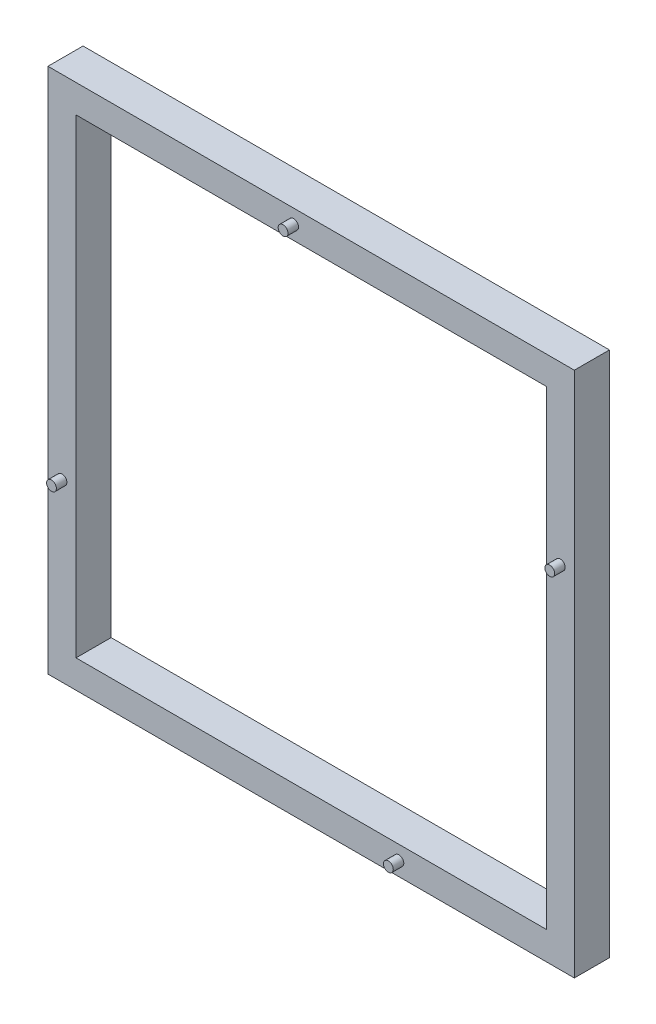
ISO-10303-21;
HEADER;
FILE_DESCRIPTION(('STEP AP214'),'2;1');
FILE_NAME('part.step','',(''),(''),'','','');
FILE_SCHEMA(('AUTOMOTIVE_DESIGN { 1 0 10303 214 1 1 1 1 }'));
ENDSEC;
DATA;
#1=APPLICATION_CONTEXT('core data for automotive mechanical design processes');
#2=APPLICATION_PROTOCOL_DEFINITION('international standard','automotive_design',2000,#1);
#3=PRODUCT_CONTEXT('',#1,'mechanical');
#4=PRODUCT('Part','Part','',(#3));
#5=PRODUCT_RELATED_PRODUCT_CATEGORY('part','',(#4));
#6=PRODUCT_DEFINITION_FORMATION('','',#4);
#7=PRODUCT_DEFINITION_CONTEXT('part definition',#1,'design');
#8=PRODUCT_DEFINITION('design','',#6,#7);
#9=PRODUCT_DEFINITION_SHAPE('','',#8);
#10=(LENGTH_UNIT() NAMED_UNIT(*) SI_UNIT(.MILLI.,.METRE.));
#11=(NAMED_UNIT(*) PLANE_ANGLE_UNIT() SI_UNIT($,.RADIAN.));
#12=(NAMED_UNIT(*) SI_UNIT($,.STERADIAN.) SOLID_ANGLE_UNIT());
#13=UNCERTAINTY_MEASURE_WITH_UNIT(LENGTH_MEASURE(1.E-05),#10,'distance_accuracy_value','');
#14=(GEOMETRIC_REPRESENTATION_CONTEXT(3) GLOBAL_UNCERTAINTY_ASSIGNED_CONTEXT((#13)) GLOBAL_UNIT_ASSIGNED_CONTEXT((#10,
#11,#12)) REPRESENTATION_CONTEXT('',''));
#15=CARTESIAN_POINT('',(0.,0.,0.));
#16=DIRECTION('',(0.,0.,1.));
#17=DIRECTION('',(1.,0.,0.));
#18=AXIS2_PLACEMENT_3D('',#15,#16,#17);
#19=CARTESIAN_POINT('',(-72.2107438016529,36.2603305785124,10.));
#20=DIRECTION('',(1.,0.,0.));
#21=DIRECTION('',(0.,1.,0.));
#22=AXIS2_PLACEMENT_3D('',#19,#20,#21);
#23=PLANE('',#22);
#24=DIRECTION('',(0.,-1.,0.));
#25=VECTOR('',#24,1.);
#26=CARTESIAN_POINT('',(-72.2107438016529,36.2603305785124,0.));
#27=LINE('',#26,#25);
#28=CARTESIAN_POINT('',(-72.2107438016529,36.2603305785124,0.));
#29=VERTEX_POINT('',#28);
#30=CARTESIAN_POINT('',(-72.2107438016529,-113.739669421488,0.));
#31=VERTEX_POINT('',#30);
#32=EDGE_CURVE('E134',#29,#31,#27,.T.);
#33=ORIENTED_EDGE('',*,*,#32,.T.);
#34=DIRECTION('',(0.,0.,-1.));
#35=VECTOR('',#34,1.);
#36=CARTESIAN_POINT('',(-72.2107438016529,-113.739669421488,10.));
#37=LINE('',#36,#35);
#38=CARTESIAN_POINT('',(-72.2107438016529,-113.739669421488,10.));
#39=VERTEX_POINT('',#38);
#40=EDGE_CURVE('E11',#39,#31,#37,.T.);
#41=ORIENTED_EDGE('',*,*,#40,.F.);
#42=DIRECTION('',(0.,-1.,0.));
#43=VECTOR('',#42,1.);
#44=CARTESIAN_POINT('',(-72.2107438016529,36.2603305785124,10.));
#45=LINE('',#44,#43);
#46=CARTESIAN_POINT('',(-72.2107438016529,36.2603305785124,10.));
#47=VERTEX_POINT('',#46);
#48=EDGE_CURVE('E138',#47,#39,#45,.T.);
#49=ORIENTED_EDGE('',*,*,#48,.F.);
#50=DIRECTION('',(0.,0.,-1.));
#51=VECTOR('',#50,1.);
#52=CARTESIAN_POINT('',(-72.2107438016529,36.2603305785124,10.));
#53=LINE('',#52,#51);
#54=EDGE_CURVE('E148',#47,#29,#53,.T.);
#55=ORIENTED_EDGE('',*,*,#54,.T.);
#56=EDGE_LOOP('',(#33,#41,#49,#55));
#57=FACE_BOUND('',#56,.T.);
#58=ADVANCED_FACE('F33',(#57),#23,.F.);
#59=CARTESIAN_POINT('',(-72.2107438016529,-113.739669421488,10.));
#60=DIRECTION('',(0.,1.,0.));
#61=DIRECTION('',(0.,0.,1.));
#62=AXIS2_PLACEMENT_3D('',#59,#60,#61);
#63=PLANE('',#62);
#64=DIRECTION('',(1.,0.,0.));
#65=VECTOR('',#64,1.);
#66=CARTESIAN_POINT('',(-72.2107438016529,-113.739669421488,0.));
#67=LINE('',#66,#65);
#68=CARTESIAN_POINT('',(77.7892561983471,-113.739669421488,0.));
#69=VERTEX_POINT('',#68);
#70=EDGE_CURVE('E151',#31,#69,#67,.T.);
#71=ORIENTED_EDGE('',*,*,#70,.T.);
#72=DIRECTION('',(0.,0.,-1.));
#73=VECTOR('',#72,1.);
#74=CARTESIAN_POINT('',(77.7892561983471,-113.739669421488,10.));
#75=LINE('',#74,#73);
#76=CARTESIAN_POINT('',(77.7892561983471,-113.739669421488,10.));
#77=VERTEX_POINT('',#76);
#78=EDGE_CURVE('E40',#77,#69,#75,.T.);
#79=ORIENTED_EDGE('',*,*,#78,.F.);
#80=DIRECTION('',(1.,0.,0.));
#81=VECTOR('',#80,1.);
#82=CARTESIAN_POINT('',(-72.2107438016529,-113.739669421488,10.));
#83=LINE('',#82,#81);
#84=EDGE_CURVE('E141',#39,#77,#83,.T.);
#85=ORIENTED_EDGE('',*,*,#84,.F.);
#86=ORIENTED_EDGE('',*,*,#40,.T.);
#87=EDGE_LOOP('',(#71,#79,#85,#86));
#88=FACE_BOUND('',#87,.T.);
#89=ADVANCED_FACE('F179',(#88),#63,.F.);
#90=CARTESIAN_POINT('',(77.7892561983471,36.2603305785124,10.));
#91=DIRECTION('',(-1.,0.,0.));
#92=DIRECTION('',(0.,-1.,0.));
#93=AXIS2_PLACEMENT_3D('',#90,#91,#92);
#94=PLANE('',#93);
#95=DIRECTION('',(0.,1.,0.));
#96=VECTOR('',#95,1.);
#97=CARTESIAN_POINT('',(77.7892561983471,36.2603305785124,0.));
#98=LINE('',#97,#96);
#99=CARTESIAN_POINT('',(77.7892561983471,36.2603305785124,0.));
#100=VERTEX_POINT('',#99);
#101=EDGE_CURVE('E153',#69,#100,#98,.T.);
#102=ORIENTED_EDGE('',*,*,#101,.T.);
#103=DIRECTION('',(0.,0.,-1.));
#104=VECTOR('',#103,1.);
#105=CARTESIAN_POINT('',(77.7892561983471,36.2603305785124,10.));
#106=LINE('',#105,#104);
#107=CARTESIAN_POINT('',(77.7892561983471,36.2603305785124,10.));
#108=VERTEX_POINT('',#107);
#109=EDGE_CURVE('E158',#108,#100,#106,.T.);
#110=ORIENTED_EDGE('',*,*,#109,.F.);
#111=DIRECTION('',(0.,1.,0.));
#112=VECTOR('',#111,1.);
#113=CARTESIAN_POINT('',(77.7892561983471,36.2603305785124,10.));
#114=LINE('',#113,#112);
#115=EDGE_CURVE('E144',#77,#108,#114,.T.);
#116=ORIENTED_EDGE('',*,*,#115,.F.);
#117=ORIENTED_EDGE('',*,*,#78,.T.);
#118=EDGE_LOOP('',(#102,#110,#116,#117));
#119=FACE_BOUND('',#118,.T.);
#120=ADVANCED_FACE('F165',(#119),#94,.F.);
#121=CARTESIAN_POINT('',(-72.2107438016529,36.2603305785124,10.));
#122=DIRECTION('',(0.,-1.,0.));
#123=DIRECTION('',(0.,0.,-1.));
#124=AXIS2_PLACEMENT_3D('',#121,#122,#123);
#125=PLANE('',#124);
#126=DIRECTION('',(-1.,0.,0.));
#127=VECTOR('',#126,1.);
#128=CARTESIAN_POINT('',(-72.2107438016529,36.2603305785124,0.));
#129=LINE('',#128,#127);
#130=EDGE_CURVE('E142',#100,#29,#129,.T.);
#131=ORIENTED_EDGE('',*,*,#130,.T.);
#132=ORIENTED_EDGE('',*,*,#54,.F.);
#133=DIRECTION('',(-1.,0.,0.));
#134=VECTOR('',#133,1.);
#135=CARTESIAN_POINT('',(-72.2107438016529,36.2603305785124,10.));
#136=LINE('',#135,#134);
#137=EDGE_CURVE('E146',#108,#47,#136,.T.);
#138=ORIENTED_EDGE('',*,*,#137,.F.);
#139=ORIENTED_EDGE('',*,*,#109,.T.);
#140=EDGE_LOOP('',(#131,#132,#138,#139));
#141=FACE_BOUND('',#140,.T.);
#142=ADVANCED_FACE('F172',(#141),#125,.F.);
#143=CARTESIAN_POINT('',(0.,0.,10.));
#144=DIRECTION('',(0.,0.,1.));
#145=DIRECTION('',(1.,0.,0.));
#146=AXIS2_PLACEMENT_3D('',#143,#144,#145);
#147=PLANE('',#146);
#148=CARTESIAN_POINT('',(-2.2107438016529,32.2603305785124,10.));
#149=DIRECTION('',(0.,0.,1.));
#150=DIRECTION('',(1.,0.,0.));
#151=AXIS2_PLACEMENT_3D('',#148,#149,#150);
#152=CIRCLE('',#151,1.4);
#153=CARTESIAN_POINT('',(-0.810743801652899,32.2603305785124,10.));
#154=VERTEX_POINT('',#153);
#155=EDGE_CURVE('E242',#154,#154,#152,.T.);
#156=ORIENTED_EDGE('',*,*,#155,.F.);
#157=EDGE_LOOP('',(#156));
#158=FACE_BOUND('',#157,.T.);
#159=CARTESIAN_POINT('',(-68.2107438016529,-63.7396694214876,10.));
#160=DIRECTION('',(0.,0.,1.));
#161=DIRECTION('',(1.,0.,0.));
#162=AXIS2_PLACEMENT_3D('',#159,#160,#161);
#163=CIRCLE('',#162,1.4);
#164=CARTESIAN_POINT('',(-66.8107438016529,-63.7396694214876,10.));
#165=VERTEX_POINT('',#164);
#166=EDGE_CURVE('E241',#165,#165,#163,.T.);
#167=ORIENTED_EDGE('',*,*,#166,.F.);
#168=EDGE_LOOP('',(#167));
#169=FACE_BOUND('',#168,.T.);
#170=CARTESIAN_POINT('',(27.7892561983471,-109.739669421488,10.));
#171=DIRECTION('',(0.,0.,1.));
#172=DIRECTION('',(1.,0.,0.));
#173=AXIS2_PLACEMENT_3D('',#170,#171,#172);
#174=CIRCLE('',#173,1.4);
#175=CARTESIAN_POINT('',(29.1892561983471,-109.739669421488,10.));
#176=VERTEX_POINT('',#175);
#177=EDGE_CURVE('E251',#176,#176,#174,.T.);
#178=ORIENTED_EDGE('',*,*,#177,.F.);
#179=EDGE_LOOP('',(#178));
#180=FACE_BOUND('',#179,.T.);
#181=CARTESIAN_POINT('',(73.7892561983471,-13.7396694214876,10.));
#182=DIRECTION('',(0.,0.,1.));
#183=DIRECTION('',(1.,0.,0.));
#184=AXIS2_PLACEMENT_3D('',#181,#182,#183);
#185=CIRCLE('',#184,1.4);
#186=CARTESIAN_POINT('',(75.1892561983471,-13.7396694214876,10.));
#187=VERTEX_POINT('',#186);
#188=EDGE_CURVE('E121',#187,#187,#185,.T.);
#189=ORIENTED_EDGE('',*,*,#188,.F.);
#190=EDGE_LOOP('',(#189));
#191=FACE_BOUND('',#190,.T.);
#192=DIRECTION('',(0.,1.,0.));
#193=VECTOR('',#192,1.);
#194=CARTESIAN_POINT('',(69.7892561983471,28.2603305785124,10.));
#195=LINE('',#194,#193);
#196=CARTESIAN_POINT('',(69.7892561983471,-105.739669421488,10.));
#197=VERTEX_POINT('',#196);
#198=CARTESIAN_POINT('',(69.7892561983471,28.2603305785124,10.));
#199=VERTEX_POINT('',#198);
#200=EDGE_CURVE('E47',#197,#199,#195,.T.);
#201=ORIENTED_EDGE('',*,*,#200,.F.);
#202=DIRECTION('',(1.,0.,0.));
#203=VECTOR('',#202,1.);
#204=CARTESIAN_POINT('',(69.7892561983471,-105.739669421488,10.));
#205=LINE('',#204,#203);
#206=CARTESIAN_POINT('',(-64.2107438016529,-105.739669421488,10.));
#207=VERTEX_POINT('',#206);
#208=EDGE_CURVE('E115',#207,#197,#205,.T.);
#209=ORIENTED_EDGE('',*,*,#208,.F.);
#210=DIRECTION('',(0.,-1.,0.));
#211=VECTOR('',#210,1.);
#212=CARTESIAN_POINT('',(-64.2107438016529,28.2603305785124,10.));
#213=LINE('',#212,#211);
#214=CARTESIAN_POINT('',(-64.2107438016529,28.2603305785124,10.));
#215=VERTEX_POINT('',#214);
#216=EDGE_CURVE('E118',#215,#207,#213,.T.);
#217=ORIENTED_EDGE('',*,*,#216,.F.);
#218=DIRECTION('',(-1.,0.,0.));
#219=VECTOR('',#218,1.);
#220=CARTESIAN_POINT('',(69.7892561983471,28.2603305785124,10.));
#221=LINE('',#220,#219);
#222=EDGE_CURVE('E127',#199,#215,#221,.T.);
#223=ORIENTED_EDGE('',*,*,#222,.F.);
#224=EDGE_LOOP('',(#201,#209,#217,#223));
#225=FACE_BOUND('',#224,.T.);
#226=ORIENTED_EDGE('',*,*,#48,.T.);
#227=ORIENTED_EDGE('',*,*,#84,.T.);
#228=ORIENTED_EDGE('',*,*,#115,.T.);
#229=ORIENTED_EDGE('',*,*,#137,.T.);
#230=EDGE_LOOP('',(#226,#227,#228,#229));
#231=FACE_BOUND('',#230,.T.);
#232=ADVANCED_FACE('F178',(#158,#169,#180,#191,#225,#231),#147,.T.);
#233=CARTESIAN_POINT('',(0.,0.,0.));
#234=DIRECTION('',(0.,0.,1.));
#235=DIRECTION('',(1.,0.,0.));
#236=AXIS2_PLACEMENT_3D('',#233,#234,#235);
#237=PLANE('',#236);
#238=DIRECTION('',(1.,0.,0.));
#239=VECTOR('',#238,1.);
#240=CARTESIAN_POINT('',(69.7892561983471,-105.739669421488,0.));
#241=LINE('',#240,#239);
#242=CARTESIAN_POINT('',(-64.2107438016529,-105.739669421488,0.));
#243=VERTEX_POINT('',#242);
#244=CARTESIAN_POINT('',(69.7892561983471,-105.739669421488,0.));
#245=VERTEX_POINT('',#244);
#246=EDGE_CURVE('E105',#243,#245,#241,.T.);
#247=ORIENTED_EDGE('',*,*,#246,.T.);
#248=DIRECTION('',(0.,1.,0.));
#249=VECTOR('',#248,1.);
#250=CARTESIAN_POINT('',(69.7892561983471,28.2603305785124,0.));
#251=LINE('',#250,#249);
#252=CARTESIAN_POINT('',(69.7892561983471,28.2603305785124,0.));
#253=VERTEX_POINT('',#252);
#254=EDGE_CURVE('E99',#245,#253,#251,.T.);
#255=ORIENTED_EDGE('',*,*,#254,.T.);
#256=DIRECTION('',(-1.,0.,0.));
#257=VECTOR('',#256,1.);
#258=CARTESIAN_POINT('',(69.7892561983471,28.2603305785124,0.));
#259=LINE('',#258,#257);
#260=CARTESIAN_POINT('',(-64.2107438016529,28.2603305785124,0.));
#261=VERTEX_POINT('',#260);
#262=EDGE_CURVE('E108',#253,#261,#259,.T.);
#263=ORIENTED_EDGE('',*,*,#262,.T.);
#264=DIRECTION('',(0.,-1.,0.));
#265=VECTOR('',#264,1.);
#266=CARTESIAN_POINT('',(-64.2107438016529,28.2603305785124,0.));
#267=LINE('',#266,#265);
#268=EDGE_CURVE('E55',#261,#243,#267,.T.);
#269=ORIENTED_EDGE('',*,*,#268,.T.);
#270=EDGE_LOOP('',(#247,#255,#263,#269));
#271=FACE_BOUND('',#270,.T.);
#272=ORIENTED_EDGE('',*,*,#32,.F.);
#273=ORIENTED_EDGE('',*,*,#130,.F.);
#274=ORIENTED_EDGE('',*,*,#101,.F.);
#275=ORIENTED_EDGE('',*,*,#70,.F.);
#276=EDGE_LOOP('',(#272,#273,#274,#275));
#277=FACE_BOUND('',#276,.T.);
#278=ADVANCED_FACE('F112',(#271,#277),#237,.F.);
#279=CARTESIAN_POINT('',(69.7892561983471,28.2603305785124,0.));
#280=DIRECTION('',(1.,0.,0.));
#281=DIRECTION('',(0.,1.,0.));
#282=AXIS2_PLACEMENT_3D('',#279,#280,#281);
#283=PLANE('',#282);
#284=ORIENTED_EDGE('',*,*,#200,.T.);
#285=DIRECTION('',(0.,0.,1.));
#286=VECTOR('',#285,1.);
#287=CARTESIAN_POINT('',(69.7892561983471,28.2603305785124,0.));
#288=LINE('',#287,#286);
#289=EDGE_CURVE('E95',#253,#199,#288,.T.);
#290=ORIENTED_EDGE('',*,*,#289,.F.);
#291=ORIENTED_EDGE('',*,*,#254,.F.);
#292=DIRECTION('',(0.,0.,1.));
#293=VECTOR('',#292,1.);
#294=CARTESIAN_POINT('',(69.7892561983471,-105.739669421488,0.));
#295=LINE('',#294,#293);
#296=EDGE_CURVE('E132',#245,#197,#295,.T.);
#297=ORIENTED_EDGE('',*,*,#296,.T.);
#298=EDGE_LOOP('',(#284,#290,#291,#297));
#299=FACE_BOUND('',#298,.T.);
#300=ADVANCED_FACE('F97',(#299),#283,.F.);
#301=CARTESIAN_POINT('',(69.7892561983471,-105.739669421488,0.));
#302=DIRECTION('',(0.,-1.,0.));
#303=DIRECTION('',(1.,0.,0.));
#304=AXIS2_PLACEMENT_3D('',#301,#302,#303);
#305=PLANE('',#304);
#306=ORIENTED_EDGE('',*,*,#208,.T.);
#307=ORIENTED_EDGE('',*,*,#296,.F.);
#308=ORIENTED_EDGE('',*,*,#246,.F.);
#309=DIRECTION('',(0.,0.,1.));
#310=VECTOR('',#309,1.);
#311=CARTESIAN_POINT('',(-64.2107438016529,-105.739669421488,0.));
#312=LINE('',#311,#310);
#313=EDGE_CURVE('E135',#243,#207,#312,.T.);
#314=ORIENTED_EDGE('',*,*,#313,.T.);
#315=EDGE_LOOP('',(#306,#307,#308,#314));
#316=FACE_BOUND('',#315,.T.);
#317=ADVANCED_FACE('F196',(#316),#305,.F.);
#318=CARTESIAN_POINT('',(-64.2107438016529,28.2603305785124,0.));
#319=DIRECTION('',(-1.,0.,0.));
#320=DIRECTION('',(0.,-1.,0.));
#321=AXIS2_PLACEMENT_3D('',#318,#319,#320);
#322=PLANE('',#321);
#323=ORIENTED_EDGE('',*,*,#216,.T.);
#324=ORIENTED_EDGE('',*,*,#313,.F.);
#325=ORIENTED_EDGE('',*,*,#268,.F.);
#326=DIRECTION('',(0.,0.,1.));
#327=VECTOR('',#326,1.);
#328=CARTESIAN_POINT('',(-64.2107438016529,28.2603305785124,0.));
#329=LINE('',#328,#327);
#330=EDGE_CURVE('E104',#261,#215,#329,.T.);
#331=ORIENTED_EDGE('',*,*,#330,.T.);
#332=EDGE_LOOP('',(#323,#324,#325,#331));
#333=FACE_BOUND('',#332,.T.);
#334=ADVANCED_FACE('F200',(#333),#322,.F.);
#335=CARTESIAN_POINT('',(69.7892561983471,28.2603305785124,0.));
#336=DIRECTION('',(0.,1.,0.));
#337=DIRECTION('',(-1.,0.,0.));
#338=AXIS2_PLACEMENT_3D('',#335,#336,#337);
#339=PLANE('',#338);
#340=ORIENTED_EDGE('',*,*,#222,.T.);
#341=ORIENTED_EDGE('',*,*,#330,.F.);
#342=ORIENTED_EDGE('',*,*,#262,.F.);
#343=ORIENTED_EDGE('',*,*,#289,.T.);
#344=EDGE_LOOP('',(#340,#341,#342,#343));
#345=FACE_BOUND('',#344,.T.);
#346=ADVANCED_FACE('F109',(#345),#339,.F.);
#347=CARTESIAN_POINT('',(73.7892561983471,-13.7396694214876,13.));
#348=DIRECTION('',(0.,0.,-1.));
#349=DIRECTION('',(-1.,0.,0.));
#350=AXIS2_PLACEMENT_3D('',#347,#348,#349);
#351=CYLINDRICAL_SURFACE('',#350,1.4);
#352=CARTESIAN_POINT('',(73.7892561983471,-13.7396694214876,13.));
#353=DIRECTION('',(0.,0.,1.));
#354=DIRECTION('',(1.,0.,0.));
#355=AXIS2_PLACEMENT_3D('',#352,#353,#354);
#356=CIRCLE('',#355,1.4);
#357=CARTESIAN_POINT('',(75.1892561983471,-13.7396694214876,13.));
#358=VERTEX_POINT('',#357);
#359=EDGE_CURVE('E128',#358,#358,#356,.T.);
#360=ORIENTED_EDGE('',*,*,#359,.F.);
#361=EDGE_LOOP('',(#360));
#362=FACE_BOUND('',#361,.T.);
#363=ORIENTED_EDGE('',*,*,#188,.T.);
#364=EDGE_LOOP('',(#363));
#365=FACE_BOUND('',#364,.T.);
#366=ADVANCED_FACE('F199',(#362,#365),#351,.T.);
#367=CARTESIAN_POINT('',(73.7892561983471,-13.7396694214876,13.));
#368=DIRECTION('',(0.,0.,1.));
#369=DIRECTION('',(1.,0.,0.));
#370=AXIS2_PLACEMENT_3D('',#367,#368,#369);
#371=PLANE('',#370);
#372=ORIENTED_EDGE('',*,*,#359,.T.);
#373=EDGE_LOOP('',(#372));
#374=FACE_BOUND('',#373,.T.);
#375=ADVANCED_FACE('F208',(#374),#371,.T.);
#376=CARTESIAN_POINT('',(27.7892561983471,-109.739669421488,13.));
#377=DIRECTION('',(0.,0.,-1.));
#378=DIRECTION('',(-1.,0.,0.));
#379=AXIS2_PLACEMENT_3D('',#376,#377,#378);
#380=CYLINDRICAL_SURFACE('',#379,1.4);
#381=CARTESIAN_POINT('',(27.7892561983471,-109.739669421488,13.));
#382=DIRECTION('',(0.,0.,1.));
#383=DIRECTION('',(1.,0.,0.));
#384=AXIS2_PLACEMENT_3D('',#381,#382,#383);
#385=CIRCLE('',#384,1.4);
#386=CARTESIAN_POINT('',(29.1892561983471,-109.739669421488,13.));
#387=VERTEX_POINT('',#386);
#388=EDGE_CURVE('E253',#387,#387,#385,.T.);
#389=ORIENTED_EDGE('',*,*,#388,.F.);
#390=EDGE_LOOP('',(#389));
#391=FACE_BOUND('',#390,.T.);
#392=ORIENTED_EDGE('',*,*,#177,.T.);
#393=EDGE_LOOP('',(#392));
#394=FACE_BOUND('',#393,.T.);
#395=ADVANCED_FACE('F212',(#391,#394),#380,.T.);
#396=CARTESIAN_POINT('',(27.7892561983471,-109.739669421488,13.));
#397=DIRECTION('',(0.,0.,1.));
#398=DIRECTION('',(1.,0.,0.));
#399=AXIS2_PLACEMENT_3D('',#396,#397,#398);
#400=PLANE('',#399);
#401=ORIENTED_EDGE('',*,*,#388,.T.);
#402=EDGE_LOOP('',(#401));
#403=FACE_BOUND('',#402,.T.);
#404=ADVANCED_FACE('F216',(#403),#400,.T.);
#405=CARTESIAN_POINT('',(-68.2107438016529,-63.7396694214876,13.));
#406=DIRECTION('',(0.,0.,-1.));
#407=DIRECTION('',(-1.,0.,0.));
#408=AXIS2_PLACEMENT_3D('',#405,#406,#407);
#409=CYLINDRICAL_SURFACE('',#408,1.4);
#410=CARTESIAN_POINT('',(-68.2107438016529,-63.7396694214876,13.));
#411=DIRECTION('',(0.,0.,1.));
#412=DIRECTION('',(1.,0.,0.));
#413=AXIS2_PLACEMENT_3D('',#410,#411,#412);
#414=CIRCLE('',#413,1.4);
#415=CARTESIAN_POINT('',(-66.8107438016529,-63.7396694214876,13.));
#416=VERTEX_POINT('',#415);
#417=EDGE_CURVE('E245',#416,#416,#414,.T.);
#418=ORIENTED_EDGE('',*,*,#417,.F.);
#419=EDGE_LOOP('',(#418));
#420=FACE_BOUND('',#419,.T.);
#421=ORIENTED_EDGE('',*,*,#166,.T.);
#422=EDGE_LOOP('',(#421));
#423=FACE_BOUND('',#422,.T.);
#424=ADVANCED_FACE('F220',(#420,#423),#409,.T.);
#425=CARTESIAN_POINT('',(-68.2107438016529,-63.7396694214876,13.));
#426=DIRECTION('',(0.,0.,1.));
#427=DIRECTION('',(1.,0.,0.));
#428=AXIS2_PLACEMENT_3D('',#425,#426,#427);
#429=PLANE('',#428);
#430=ORIENTED_EDGE('',*,*,#417,.T.);
#431=EDGE_LOOP('',(#430));
#432=FACE_BOUND('',#431,.T.);
#433=ADVANCED_FACE('F224',(#432),#429,.T.);
#434=CARTESIAN_POINT('',(-2.2107438016529,32.2603305785124,13.));
#435=DIRECTION('',(0.,0.,-1.));
#436=DIRECTION('',(-1.,0.,0.));
#437=AXIS2_PLACEMENT_3D('',#434,#435,#436);
#438=CYLINDRICAL_SURFACE('',#437,1.4);
#439=CARTESIAN_POINT('',(-2.2107438016529,32.2603305785124,13.));
#440=DIRECTION('',(0.,0.,1.));
#441=DIRECTION('',(1.,0.,0.));
#442=AXIS2_PLACEMENT_3D('',#439,#440,#441);
#443=CIRCLE('',#442,1.4);
#444=CARTESIAN_POINT('',(-0.810743801652899,32.2603305785124,13.));
#445=VERTEX_POINT('',#444);
#446=EDGE_CURVE('E240',#445,#445,#443,.T.);
#447=ORIENTED_EDGE('',*,*,#446,.F.);
#448=EDGE_LOOP('',(#447));
#449=FACE_BOUND('',#448,.T.);
#450=ORIENTED_EDGE('',*,*,#155,.T.);
#451=EDGE_LOOP('',(#450));
#452=FACE_BOUND('',#451,.T.);
#453=ADVANCED_FACE('F228',(#449,#452),#438,.T.);
#454=CARTESIAN_POINT('',(-2.2107438016529,32.2603305785124,13.));
#455=DIRECTION('',(0.,0.,1.));
#456=DIRECTION('',(1.,0.,0.));
#457=AXIS2_PLACEMENT_3D('',#454,#455,#456);
#458=PLANE('',#457);
#459=ORIENTED_EDGE('',*,*,#446,.T.);
#460=EDGE_LOOP('',(#459));
#461=FACE_BOUND('',#460,.T.);
#462=ADVANCED_FACE('F232',(#461),#458,.T.);
#463=CLOSED_SHELL('',(#58,#89,#120,#142,#232,#278,#300,#317,#334,#346,#366,#375,#395,#404,#424,
#433,#453,#462));
#464=MANIFOLD_SOLID_BREP('B2',#463);
#465=ADVANCED_BREP_SHAPE_REPRESENTATION('',(#18,#464),#14);
#466=SHAPE_DEFINITION_REPRESENTATION(#9,#465);
ENDSEC;
END-ISO-10303-21;
